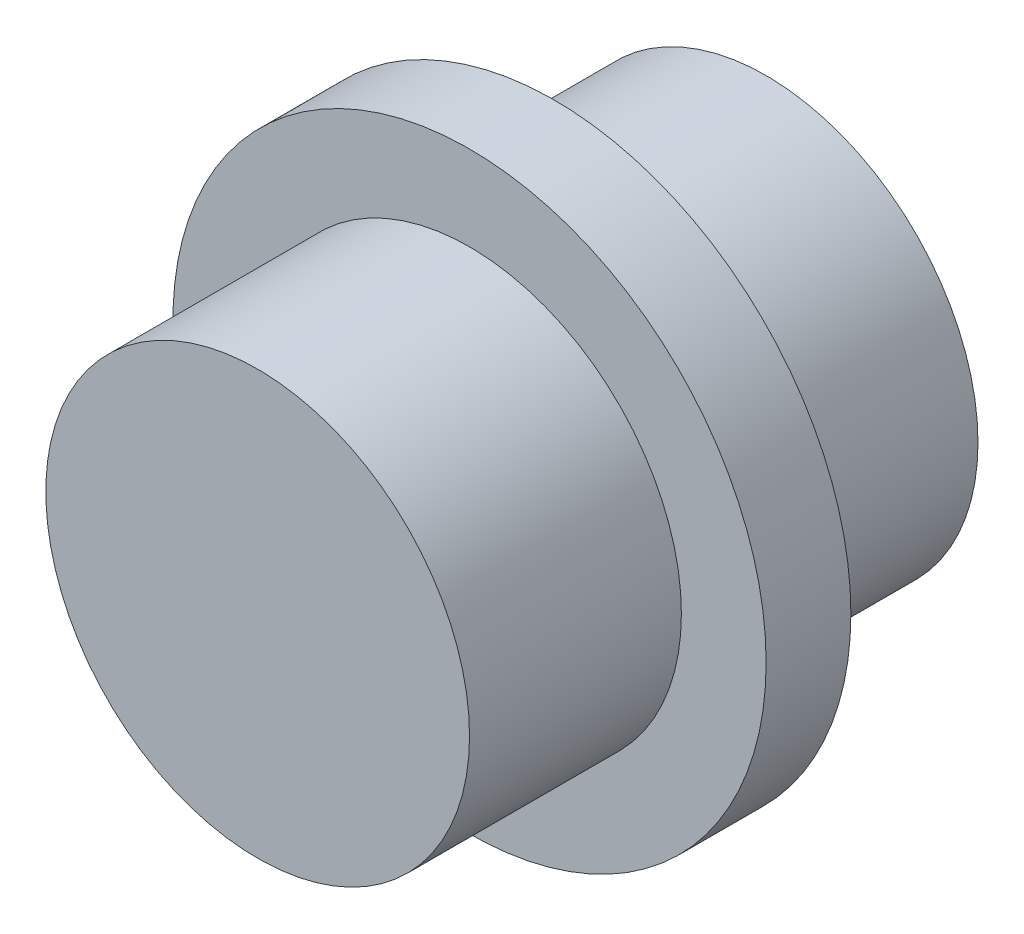
ISO-10303-21;
HEADER;
FILE_DESCRIPTION(('STEP AP214'),'2;1');
FILE_NAME('part.step','',(''),(''),'','','');
FILE_SCHEMA(('AUTOMOTIVE_DESIGN { 1 0 10303 214 1 1 1 1 }'));
ENDSEC;
DATA;
#1=APPLICATION_CONTEXT('core data for automotive mechanical design processes');
#2=APPLICATION_PROTOCOL_DEFINITION('international standard','automotive_design',2000,#1);
#3=PRODUCT_CONTEXT('',#1,'mechanical');
#4=PRODUCT('Part','Part','',(#3));
#5=PRODUCT_RELATED_PRODUCT_CATEGORY('part','',(#4));
#6=PRODUCT_DEFINITION_FORMATION('','',#4);
#7=PRODUCT_DEFINITION_CONTEXT('part definition',#1,'design');
#8=PRODUCT_DEFINITION('design','',#6,#7);
#9=PRODUCT_DEFINITION_SHAPE('','',#8);
#10=(LENGTH_UNIT() NAMED_UNIT(*) SI_UNIT(.MILLI.,.METRE.));
#11=(NAMED_UNIT(*) PLANE_ANGLE_UNIT() SI_UNIT($,.RADIAN.));
#12=(NAMED_UNIT(*) SI_UNIT($,.STERADIAN.) SOLID_ANGLE_UNIT());
#13=UNCERTAINTY_MEASURE_WITH_UNIT(LENGTH_MEASURE(1.E-05),#10,'distance_accuracy_value','');
#14=(GEOMETRIC_REPRESENTATION_CONTEXT(3) GLOBAL_UNCERTAINTY_ASSIGNED_CONTEXT((#13)) GLOBAL_UNIT_ASSIGNED_CONTEXT((#10,
#11,#12)) REPRESENTATION_CONTEXT('',''));
#15=CARTESIAN_POINT('',(0.,0.,0.));
#16=DIRECTION('',(0.,0.,1.));
#17=DIRECTION('',(1.,0.,0.));
#18=AXIS2_PLACEMENT_3D('',#15,#16,#17);
#19=CARTESIAN_POINT('',(0.,0.,5.));
#20=DIRECTION('',(0.,0.,-1.));
#21=DIRECTION('',(-1.,0.,0.));
#22=AXIS2_PLACEMENT_3D('',#19,#20,#21);
#23=CYLINDRICAL_SURFACE('',#22,5.);
#24=CARTESIAN_POINT('',(0.,0.,5.));
#25=DIRECTION('',(0.,0.,1.));
#26=DIRECTION('',(1.,0.,0.));
#27=AXIS2_PLACEMENT_3D('',#24,#25,#26);
#28=CIRCLE('',#27,5.);
#29=CARTESIAN_POINT('',(5.,0.,5.));
#30=VERTEX_POINT('',#29);
#31=EDGE_CURVE('E38',#30,#30,#28,.T.);
#32=ORIENTED_EDGE('',*,*,#31,.F.);
#33=EDGE_LOOP('',(#32));
#34=FACE_BOUND('',#33,.T.);
#35=CARTESIAN_POINT('',(0.,0.,0.));
#36=DIRECTION('',(0.,0.,1.));
#37=DIRECTION('',(1.,0.,0.));
#38=AXIS2_PLACEMENT_3D('',#35,#36,#37);
#39=CIRCLE('',#38,5.);
#40=CARTESIAN_POINT('',(5.,0.,0.));
#41=VERTEX_POINT('',#40);
#42=EDGE_CURVE('E34',#41,#41,#39,.T.);
#43=ORIENTED_EDGE('',*,*,#42,.T.);
#44=EDGE_LOOP('',(#43));
#45=FACE_BOUND('',#44,.T.);
#46=ADVANCED_FACE('F31',(#34,#45),#23,.T.);
#47=CARTESIAN_POINT('',(0.,0.,0.));
#48=DIRECTION('',(0.,0.,1.));
#49=DIRECTION('',(1.,0.,0.));
#50=AXIS2_PLACEMENT_3D('',#47,#48,#49);
#51=PLANE('',#50);
#52=ORIENTED_EDGE('',*,*,#42,.F.);
#53=EDGE_LOOP('',(#52));
#54=FACE_BOUND('',#53,.T.);
#55=ADVANCED_FACE('F72',(#54),#51,.F.);
#56=CARTESIAN_POINT('',(0.,0.,7.));
#57=DIRECTION('',(0.,0.,-1.));
#58=DIRECTION('',(-1.,0.,0.));
#59=AXIS2_PLACEMENT_3D('',#56,#57,#58);
#60=CYLINDRICAL_SURFACE('',#59,7.);
#61=CARTESIAN_POINT('',(0.,0.,7.));
#62=DIRECTION('',(0.,0.,1.));
#63=DIRECTION('',(1.,0.,0.));
#64=AXIS2_PLACEMENT_3D('',#61,#62,#63);
#65=CIRCLE('',#64,7.);
#66=CARTESIAN_POINT('',(7.,0.,7.));
#67=VERTEX_POINT('',#66);
#68=EDGE_CURVE('E46',#67,#67,#65,.T.);
#69=ORIENTED_EDGE('',*,*,#68,.F.);
#70=EDGE_LOOP('',(#69));
#71=FACE_BOUND('',#70,.T.);
#72=CARTESIAN_POINT('',(0.,0.,5.));
#73=DIRECTION('',(0.,0.,1.));
#74=DIRECTION('',(1.,0.,0.));
#75=AXIS2_PLACEMENT_3D('',#72,#73,#74);
#76=CIRCLE('',#75,7.);
#77=CARTESIAN_POINT('',(7.,0.,5.));
#78=VERTEX_POINT('',#77);
#79=EDGE_CURVE('E49',#78,#78,#76,.T.);
#80=ORIENTED_EDGE('',*,*,#79,.T.);
#81=EDGE_LOOP('',(#80));
#82=FACE_BOUND('',#81,.T.);
#83=ADVANCED_FACE('F77',(#71,#82),#60,.T.);
#84=CARTESIAN_POINT('',(0.,0.,7.));
#85=DIRECTION('',(0.,0.,1.));
#86=DIRECTION('',(1.,0.,0.));
#87=AXIS2_PLACEMENT_3D('',#84,#85,#86);
#88=PLANE('',#87);
#89=CARTESIAN_POINT('',(0.,0.,7.));
#90=DIRECTION('',(0.,0.,1.));
#91=DIRECTION('',(1.,0.,0.));
#92=AXIS2_PLACEMENT_3D('',#89,#90,#91);
#93=CIRCLE('',#92,5.);
#94=CARTESIAN_POINT('',(5.,0.,7.));
#95=VERTEX_POINT('',#94);
#96=EDGE_CURVE('E10',#95,#95,#93,.T.);
#97=ORIENTED_EDGE('',*,*,#96,.F.);
#98=EDGE_LOOP('',(#97));
#99=FACE_BOUND('',#98,.T.);
#100=ORIENTED_EDGE('',*,*,#68,.T.);
#101=EDGE_LOOP('',(#100));
#102=FACE_BOUND('',#101,.T.);
#103=ADVANCED_FACE('F67',(#99,#102),#88,.T.);
#104=CARTESIAN_POINT('',(0.,0.,5.));
#105=DIRECTION('',(0.,0.,1.));
#106=DIRECTION('',(1.,0.,0.));
#107=AXIS2_PLACEMENT_3D('',#104,#105,#106);
#108=PLANE('',#107);
#109=ORIENTED_EDGE('',*,*,#31,.T.);
#110=EDGE_LOOP('',(#109));
#111=FACE_BOUND('',#110,.T.);
#112=ORIENTED_EDGE('',*,*,#79,.F.);
#113=EDGE_LOOP('',(#112));
#114=FACE_BOUND('',#113,.T.);
#115=ADVANCED_FACE('F60',(#111,#114),#108,.F.);
#116=CARTESIAN_POINT('',(0.,0.,12.));
#117=DIRECTION('',(0.,0.,-1.));
#118=DIRECTION('',(-1.,0.,0.));
#119=AXIS2_PLACEMENT_3D('',#116,#117,#118);
#120=CYLINDRICAL_SURFACE('',#119,5.);
#121=CARTESIAN_POINT('',(0.,0.,12.));
#122=DIRECTION('',(0.,0.,1.));
#123=DIRECTION('',(1.,0.,0.));
#124=AXIS2_PLACEMENT_3D('',#121,#122,#123);
#125=CIRCLE('',#124,5.);
#126=CARTESIAN_POINT('',(5.,0.,12.));
#127=VERTEX_POINT('',#126);
#128=EDGE_CURVE('E45',#127,#127,#125,.T.);
#129=ORIENTED_EDGE('',*,*,#128,.F.);
#130=EDGE_LOOP('',(#129));
#131=FACE_BOUND('',#130,.T.);
#132=ORIENTED_EDGE('',*,*,#96,.T.);
#133=EDGE_LOOP('',(#132));
#134=FACE_BOUND('',#133,.T.);
#135=ADVANCED_FACE('F58',(#131,#134),#120,.T.);
#136=CARTESIAN_POINT('',(0.,0.,12.));
#137=DIRECTION('',(0.,0.,1.));
#138=DIRECTION('',(1.,0.,0.));
#139=AXIS2_PLACEMENT_3D('',#136,#137,#138);
#140=PLANE('',#139);
#141=ORIENTED_EDGE('',*,*,#128,.T.);
#142=EDGE_LOOP('',(#141));
#143=FACE_BOUND('',#142,.T.);
#144=ADVANCED_FACE('F56',(#143),#140,.T.);
#145=CLOSED_SHELL('',(#46,#55,#83,#103,#115,#135,#144));
#146=MANIFOLD_SOLID_BREP('B2',#145);
#147=ADVANCED_BREP_SHAPE_REPRESENTATION('',(#18,#146),#14);
#148=SHAPE_DEFINITION_REPRESENTATION(#9,#147);
ENDSEC;
END-ISO-10303-21;
